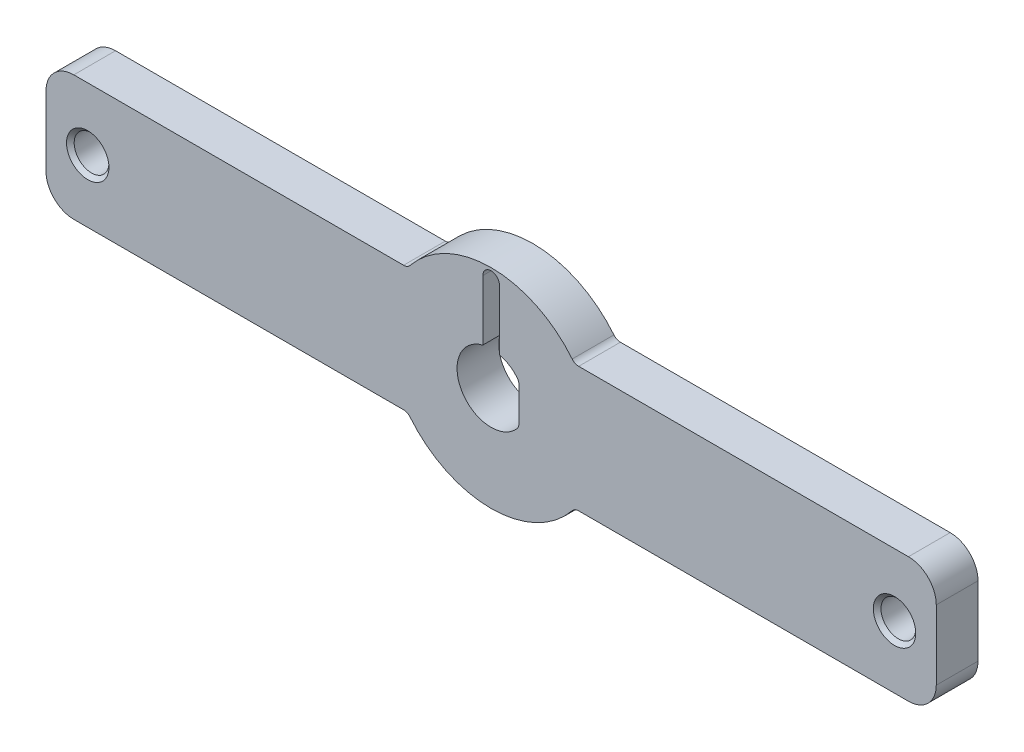
ISO-10303-21;
HEADER;
FILE_DESCRIPTION(('STEP AP214'),'2;1');
FILE_NAME('part.step','',(''),(''),'','','');
FILE_SCHEMA(('AUTOMOTIVE_DESIGN { 1 0 10303 214 1 1 1 1 }'));
ENDSEC;
DATA;
#1=APPLICATION_CONTEXT('core data for automotive mechanical design processes');
#2=APPLICATION_PROTOCOL_DEFINITION('international standard','automotive_design',2000,#1);
#3=PRODUCT_CONTEXT('',#1,'mechanical');
#4=PRODUCT('Part','Part','',(#3));
#5=PRODUCT_RELATED_PRODUCT_CATEGORY('part','',(#4));
#6=PRODUCT_DEFINITION_FORMATION('','',#4);
#7=PRODUCT_DEFINITION_CONTEXT('part definition',#1,'design');
#8=PRODUCT_DEFINITION('design','',#6,#7);
#9=PRODUCT_DEFINITION_SHAPE('','',#8);
#10=(LENGTH_UNIT() NAMED_UNIT(*) SI_UNIT(.MILLI.,.METRE.));
#11=(NAMED_UNIT(*) PLANE_ANGLE_UNIT() SI_UNIT($,.RADIAN.));
#12=(NAMED_UNIT(*) SI_UNIT($,.STERADIAN.) SOLID_ANGLE_UNIT());
#13=UNCERTAINTY_MEASURE_WITH_UNIT(LENGTH_MEASURE(1.E-05),#10,'distance_accuracy_value','');
#14=(GEOMETRIC_REPRESENTATION_CONTEXT(3) GLOBAL_UNCERTAINTY_ASSIGNED_CONTEXT((#13)) GLOBAL_UNIT_ASSIGNED_CONTEXT((#10,
#11,#12)) REPRESENTATION_CONTEXT('',''));
#15=CARTESIAN_POINT('',(0.,0.,0.));
#16=DIRECTION('',(0.,0.,1.));
#17=DIRECTION('',(1.,0.,0.));
#18=AXIS2_PLACEMENT_3D('',#15,#16,#17);
#19=CARTESIAN_POINT('',(0.,0.,3.));
#20=DIRECTION('',(0.,0.,1.));
#21=DIRECTION('',(1.,0.,0.));
#22=AXIS2_PLACEMENT_3D('',#19,#20,#21);
#23=PLANE('',#22);
#24=CARTESIAN_POINT('',(-29.,0.,3.));
#25=DIRECTION('',(0.,0.,1.));
#26=DIRECTION('',(1.,0.,0.));
#27=AXIS2_PLACEMENT_3D('',#24,#25,#26);
#28=CIRCLE('',#27,1.525);
#29=CARTESIAN_POINT('',(-27.475,0.,3.));
#30=VERTEX_POINT('',#29);
#31=EDGE_CURVE('E408',#30,#30,#28,.T.);
#32=ORIENTED_EDGE('',*,*,#31,.F.);
#33=EDGE_LOOP('',(#32));
#34=FACE_BOUND('',#33,.T.);
#35=CARTESIAN_POINT('',(29.,0.,3.));
#36=DIRECTION('',(0.,0.,1.));
#37=DIRECTION('',(1.,0.,0.));
#38=AXIS2_PLACEMENT_3D('',#35,#36,#37);
#39=CIRCLE('',#38,1.525);
#40=CARTESIAN_POINT('',(30.525,0.,3.));
#41=VERTEX_POINT('',#40);
#42=EDGE_CURVE('E628',#41,#41,#39,.T.);
#43=ORIENTED_EDGE('',*,*,#42,.F.);
#44=EDGE_LOOP('',(#43));
#45=FACE_BOUND('',#44,.T.);
#46=DIRECTION('',(-1.,0.,0.));
#47=VECTOR('',#46,1.);
#48=CARTESIAN_POINT('',(6.,4.5,3.));
#49=LINE('',#48,#47);
#50=CARTESIAN_POINT('',(30.,4.5,3.));
#51=VERTEX_POINT('',#50);
#52=CARTESIAN_POINT('',(6.29285308902091,4.5,3.));
#53=VERTEX_POINT('',#52);
#54=EDGE_CURVE('E286',#51,#53,#49,.T.);
#55=ORIENTED_EDGE('',*,*,#54,.T.);
#56=CARTESIAN_POINT('',(6.29285308902091,5.1,3.));
#57=DIRECTION('',(0.,0.,1.));
#58=DIRECTION('',(1.,0.,0.));
#59=AXIS2_PLACEMENT_3D('',#56,#57,#58);
#60=CIRCLE('',#59,0.6);
#61=CARTESIAN_POINT('',(5.82671582316751,4.72222222222222,3.));
#62=VERTEX_POINT('',#61);
#63=EDGE_CURVE('E382',#53,#62,#60,.F.);
#64=ORIENTED_EDGE('',*,*,#63,.T.);
#65=CARTESIAN_POINT('',(0.,0.,3.));
#66=DIRECTION('',(0.,0.,1.));
#67=DIRECTION('',(1.,0.,0.));
#68=AXIS2_PLACEMENT_3D('',#65,#66,#67);
#69=CIRCLE('',#68,7.5);
#70=CARTESIAN_POINT('',(-5.82671582316751,4.72222222222222,3.));
#71=VERTEX_POINT('',#70);
#72=EDGE_CURVE('E260',#62,#71,#69,.T.);
#73=ORIENTED_EDGE('',*,*,#72,.T.);
#74=CARTESIAN_POINT('',(-6.29285308902091,5.1,3.));
#75=DIRECTION('',(0.,0.,1.));
#76=DIRECTION('',(1.,0.,0.));
#77=AXIS2_PLACEMENT_3D('',#74,#75,#76);
#78=CIRCLE('',#77,0.6);
#79=CARTESIAN_POINT('',(-6.29285308902091,4.5,3.));
#80=VERTEX_POINT('',#79);
#81=EDGE_CURVE('E386',#71,#80,#78,.F.);
#82=ORIENTED_EDGE('',*,*,#81,.T.);
#83=DIRECTION('',(-1.,0.,0.));
#84=VECTOR('',#83,1.);
#85=CARTESIAN_POINT('',(-30.,4.5,3.));
#86=LINE('',#85,#84);
#87=CARTESIAN_POINT('',(-30.,4.5,3.));
#88=VERTEX_POINT('',#87);
#89=EDGE_CURVE('E263',#80,#88,#86,.T.);
#90=ORIENTED_EDGE('',*,*,#89,.T.);
#91=CARTESIAN_POINT('',(-30.,2.5,3.));
#92=DIRECTION('',(0.,0.,1.));
#93=DIRECTION('',(1.,0.,0.));
#94=AXIS2_PLACEMENT_3D('',#91,#92,#93);
#95=CIRCLE('',#94,2.);
#96=CARTESIAN_POINT('',(-32.,2.5,3.));
#97=VERTEX_POINT('',#96);
#98=EDGE_CURVE('E266',#88,#97,#95,.T.);
#99=ORIENTED_EDGE('',*,*,#98,.T.);
#100=DIRECTION('',(0.,-1.,0.));
#101=VECTOR('',#100,1.);
#102=CARTESIAN_POINT('',(-32.,2.5,3.));
#103=LINE('',#102,#101);
#104=CARTESIAN_POINT('',(-32.,-2.5,3.));
#105=VERTEX_POINT('',#104);
#106=EDGE_CURVE('E268',#97,#105,#103,.T.);
#107=ORIENTED_EDGE('',*,*,#106,.T.);
#108=CARTESIAN_POINT('',(-30.,-2.5,3.));
#109=DIRECTION('',(0.,0.,1.));
#110=DIRECTION('',(1.,0.,0.));
#111=AXIS2_PLACEMENT_3D('',#108,#109,#110);
#112=CIRCLE('',#111,2.);
#113=CARTESIAN_POINT('',(-30.,-4.5,3.));
#114=VERTEX_POINT('',#113);
#115=EDGE_CURVE('E270',#105,#114,#112,.T.);
#116=ORIENTED_EDGE('',*,*,#115,.T.);
#117=DIRECTION('',(1.,0.,0.));
#118=VECTOR('',#117,1.);
#119=CARTESIAN_POINT('',(-30.,-4.5,3.));
#120=LINE('',#119,#118);
#121=CARTESIAN_POINT('',(-6.29285308902091,-4.5,3.));
#122=VERTEX_POINT('',#121);
#123=EDGE_CURVE('E272',#114,#122,#120,.T.);
#124=ORIENTED_EDGE('',*,*,#123,.T.);
#125=CARTESIAN_POINT('',(-6.29285308902091,-5.1,3.));
#126=DIRECTION('',(0.,0.,1.));
#127=DIRECTION('',(1.,0.,0.));
#128=AXIS2_PLACEMENT_3D('',#125,#126,#127);
#129=CIRCLE('',#128,0.6);
#130=CARTESIAN_POINT('',(-5.82671582316751,-4.72222222222222,3.));
#131=VERTEX_POINT('',#130);
#132=EDGE_CURVE('E374',#122,#131,#129,.F.);
#133=ORIENTED_EDGE('',*,*,#132,.T.);
#134=CARTESIAN_POINT('',(0.,0.,3.));
#135=DIRECTION('',(0.,0.,1.));
#136=DIRECTION('',(1.,0.,0.));
#137=AXIS2_PLACEMENT_3D('',#134,#135,#136);
#138=CIRCLE('',#137,7.5);
#139=CARTESIAN_POINT('',(5.82671582316751,-4.72222222222222,3.));
#140=VERTEX_POINT('',#139);
#141=EDGE_CURVE('E275',#131,#140,#138,.T.);
#142=ORIENTED_EDGE('',*,*,#141,.T.);
#143=CARTESIAN_POINT('',(6.29285308902091,-5.1,3.));
#144=DIRECTION('',(0.,0.,1.));
#145=DIRECTION('',(1.,0.,0.));
#146=AXIS2_PLACEMENT_3D('',#143,#144,#145);
#147=CIRCLE('',#146,0.6);
#148=CARTESIAN_POINT('',(6.29285308902091,-4.5,3.));
#149=VERTEX_POINT('',#148);
#150=EDGE_CURVE('E378',#140,#149,#147,.F.);
#151=ORIENTED_EDGE('',*,*,#150,.T.);
#152=DIRECTION('',(1.,0.,0.));
#153=VECTOR('',#152,1.);
#154=CARTESIAN_POINT('',(6.,-4.5,3.));
#155=LINE('',#154,#153);
#156=CARTESIAN_POINT('',(30.,-4.5,3.));
#157=VERTEX_POINT('',#156);
#158=EDGE_CURVE('E278',#149,#157,#155,.T.);
#159=ORIENTED_EDGE('',*,*,#158,.T.);
#160=CARTESIAN_POINT('',(30.,-2.5,3.));
#161=DIRECTION('',(0.,0.,1.));
#162=DIRECTION('',(1.,0.,0.));
#163=AXIS2_PLACEMENT_3D('',#160,#161,#162);
#164=CIRCLE('',#163,2.);
#165=CARTESIAN_POINT('',(32.,-2.5,3.));
#166=VERTEX_POINT('',#165);
#167=EDGE_CURVE('E280',#157,#166,#164,.T.);
#168=ORIENTED_EDGE('',*,*,#167,.T.);
#169=DIRECTION('',(0.,1.,0.));
#170=VECTOR('',#169,1.);
#171=CARTESIAN_POINT('',(32.,2.5,3.));
#172=LINE('',#171,#170);
#173=CARTESIAN_POINT('',(32.,2.5,3.));
#174=VERTEX_POINT('',#173);
#175=EDGE_CURVE('E282',#166,#174,#172,.T.);
#176=ORIENTED_EDGE('',*,*,#175,.T.);
#177=CARTESIAN_POINT('',(30.,2.5,3.));
#178=DIRECTION('',(0.,0.,1.));
#179=DIRECTION('',(-1.,0.,0.));
#180=AXIS2_PLACEMENT_3D('',#177,#178,#179);
#181=CIRCLE('',#180,2.);
#182=EDGE_CURVE('E284',#174,#51,#181,.T.);
#183=ORIENTED_EDGE('',*,*,#182,.T.);
#184=EDGE_LOOP('',(#55,#64,#73,#82,#90,#99,#107,#116,#124,#133,#142,#151,#159,#168,#176,#183));
#185=FACE_BOUND('',#184,.T.);
#186=DIRECTION('',(0.,1.,0.));
#187=VECTOR('',#186,1.);
#188=CARTESIAN_POINT('',(0.599999999999999,7.27530068107154,3.));
#189=LINE('',#188,#187);
#190=CARTESIAN_POINT('',(0.6,2.37539470404394,3.));
#191=VERTEX_POINT('',#190);
#192=CARTESIAN_POINT('',(0.599999999999999,6.7,3.));
#193=VERTEX_POINT('',#192);
#194=EDGE_CURVE('E221',#191,#193,#189,.T.);
#195=ORIENTED_EDGE('',*,*,#194,.F.);
#196=CARTESIAN_POINT('',(0.,0.,3.));
#197=DIRECTION('',(0.,0.,1.));
#198=DIRECTION('',(1.,0.,0.));
#199=AXIS2_PLACEMENT_3D('',#196,#197,#198);
#200=CIRCLE('',#199,2.45);
#201=CARTESIAN_POINT('',(1.85405405405405,1.6015566067566,3.));
#202=VERTEX_POINT('',#201);
#203=EDGE_CURVE('E212',#202,#191,#200,.T.);
#204=ORIENTED_EDGE('',*,*,#203,.F.);
#205=CARTESIAN_POINT('',(1.4,1.20933866224478,3.));
#206=DIRECTION('',(0.,0.,1.));
#207=DIRECTION('',(1.,0.,0.));
#208=AXIS2_PLACEMENT_3D('',#205,#206,#207);
#209=CIRCLE('',#208,0.6);
#210=CARTESIAN_POINT('',(2.,1.20933866224478,3.));
#211=VERTEX_POINT('',#210);
#212=EDGE_CURVE('E394',#202,#211,#209,.F.);
#213=ORIENTED_EDGE('',*,*,#212,.T.);
#214=DIRECTION('',(0.,1.,0.));
#215=VECTOR('',#214,1.);
#216=CARTESIAN_POINT('',(2.,1.41509716980849,3.));
#217=LINE('',#216,#215);
#218=CARTESIAN_POINT('',(2.,-1.20933866224478,3.));
#219=VERTEX_POINT('',#218);
#220=EDGE_CURVE('E244',#219,#211,#217,.T.);
#221=ORIENTED_EDGE('',*,*,#220,.F.);
#222=CARTESIAN_POINT('',(1.4,-1.20933866224478,3.));
#223=DIRECTION('',(0.,0.,1.));
#224=DIRECTION('',(1.,0.,0.));
#225=AXIS2_PLACEMENT_3D('',#222,#223,#224);
#226=CIRCLE('',#225,0.6);
#227=CARTESIAN_POINT('',(1.85405405405405,-1.6015566067566,3.));
#228=VERTEX_POINT('',#227);
#229=EDGE_CURVE('E390',#219,#228,#226,.F.);
#230=ORIENTED_EDGE('',*,*,#229,.T.);
#231=CARTESIAN_POINT('',(0.,0.,3.));
#232=DIRECTION('',(0.,0.,1.));
#233=DIRECTION('',(1.,0.,0.));
#234=AXIS2_PLACEMENT_3D('',#231,#232,#233);
#235=CIRCLE('',#234,2.45);
#236=CARTESIAN_POINT('',(-0.6,2.37539470404394,3.));
#237=VERTEX_POINT('',#236);
#238=EDGE_CURVE('E238',#237,#228,#235,.T.);
#239=ORIENTED_EDGE('',*,*,#238,.F.);
#240=DIRECTION('',(0.,-1.,0.));
#241=VECTOR('',#240,1.);
#242=CARTESIAN_POINT('',(-0.600000000000001,7.27530068107154,3.));
#243=LINE('',#242,#241);
#244=CARTESIAN_POINT('',(-0.600000000000001,6.7,3.));
#245=VERTEX_POINT('',#244);
#246=EDGE_CURVE('E236',#245,#237,#243,.T.);
#247=ORIENTED_EDGE('',*,*,#246,.F.);
#248=CARTESIAN_POINT('',(0.,6.7,3.));
#249=DIRECTION('',(0.,0.,1.));
#250=DIRECTION('',(1.,0.,0.));
#251=AXIS2_PLACEMENT_3D('',#248,#249,#250);
#252=CIRCLE('',#251,0.6);
#253=CARTESIAN_POINT('',(0.,7.3,3.));
#254=VERTEX_POINT('',#253);
#255=EDGE_CURVE('E11',#245,#254,#252,.F.);
#256=ORIENTED_EDGE('',*,*,#255,.T.);
#257=CARTESIAN_POINT('',(0.,6.7,3.));
#258=DIRECTION('',(0.,0.,1.));
#259=DIRECTION('',(1.,0.,0.));
#260=AXIS2_PLACEMENT_3D('',#257,#258,#259);
#261=CIRCLE('',#260,0.6);
#262=EDGE_CURVE('E235',#254,#193,#261,.F.);
#263=ORIENTED_EDGE('',*,*,#262,.T.);
#264=EDGE_LOOP('',(#195,#204,#213,#221,#230,#239,#247,#256,#263));
#265=FACE_BOUND('',#264,.T.);
#266=ADVANCED_FACE('F45',(#34,#45,#185,#265),#23,.T.);
#267=CARTESIAN_POINT('',(0.,0.,0.));
#268=DIRECTION('',(0.,0.,1.));
#269=DIRECTION('',(1.,0.,0.));
#270=AXIS2_PLACEMENT_3D('',#267,#268,#269);
#271=PLANE('',#270);
#272=CARTESIAN_POINT('',(-29.,0.,0.));
#273=DIRECTION('',(0.,0.,1.));
#274=DIRECTION('',(1.,0.,0.));
#275=AXIS2_PLACEMENT_3D('',#272,#273,#274);
#276=CIRCLE('',#275,1.25);
#277=CARTESIAN_POINT('',(-27.75,0.,0.));
#278=VERTEX_POINT('',#277);
#279=EDGE_CURVE('E623',#278,#278,#276,.T.);
#280=ORIENTED_EDGE('',*,*,#279,.T.);
#281=EDGE_LOOP('',(#280));
#282=FACE_BOUND('',#281,.T.);
#283=CARTESIAN_POINT('',(29.,0.,0.));
#284=DIRECTION('',(0.,0.,1.));
#285=DIRECTION('',(1.,0.,0.));
#286=AXIS2_PLACEMENT_3D('',#283,#284,#285);
#287=CIRCLE('',#286,1.25);
#288=CARTESIAN_POINT('',(30.25,0.,0.));
#289=VERTEX_POINT('',#288);
#290=EDGE_CURVE('E249',#289,#289,#287,.T.);
#291=ORIENTED_EDGE('',*,*,#290,.T.);
#292=EDGE_LOOP('',(#291));
#293=FACE_BOUND('',#292,.T.);
#294=DIRECTION('',(-1.,0.,0.));
#295=VECTOR('',#294,1.);
#296=CARTESIAN_POINT('',(-30.,4.5,0.));
#297=LINE('',#296,#295);
#298=CARTESIAN_POINT('',(-6.29285308902091,4.5,0.));
#299=VERTEX_POINT('',#298);
#300=CARTESIAN_POINT('',(-30.,4.5,0.));
#301=VERTEX_POINT('',#300);
#302=EDGE_CURVE('E231',#299,#301,#297,.T.);
#303=ORIENTED_EDGE('',*,*,#302,.F.);
#304=CARTESIAN_POINT('',(-6.29285308902091,5.1,0.));
#305=DIRECTION('',(0.,0.,1.));
#306=DIRECTION('',(1.,0.,0.));
#307=AXIS2_PLACEMENT_3D('',#304,#305,#306);
#308=CIRCLE('',#307,0.6);
#309=CARTESIAN_POINT('',(-5.82671582316751,4.72222222222222,0.));
#310=VERTEX_POINT('',#309);
#311=EDGE_CURVE('E384',#299,#310,#308,.T.);
#312=ORIENTED_EDGE('',*,*,#311,.T.);
#313=CARTESIAN_POINT('',(0.,0.,0.));
#314=DIRECTION('',(0.,0.,1.));
#315=DIRECTION('',(1.,0.,0.));
#316=AXIS2_PLACEMENT_3D('',#313,#314,#315);
#317=CIRCLE('',#316,7.5);
#318=CARTESIAN_POINT('',(5.82671582316751,4.72222222222222,0.));
#319=VERTEX_POINT('',#318);
#320=EDGE_CURVE('E264',#319,#310,#317,.T.);
#321=ORIENTED_EDGE('',*,*,#320,.F.);
#322=CARTESIAN_POINT('',(6.29285308902091,5.1,0.));
#323=DIRECTION('',(0.,0.,1.));
#324=DIRECTION('',(1.,0.,0.));
#325=AXIS2_PLACEMENT_3D('',#322,#323,#324);
#326=CIRCLE('',#325,0.6);
#327=CARTESIAN_POINT('',(6.29285308902091,4.5,0.));
#328=VERTEX_POINT('',#327);
#329=EDGE_CURVE('E380',#319,#328,#326,.T.);
#330=ORIENTED_EDGE('',*,*,#329,.T.);
#331=DIRECTION('',(-1.,0.,0.));
#332=VECTOR('',#331,1.);
#333=CARTESIAN_POINT('',(6.,4.5,0.));
#334=LINE('',#333,#332);
#335=CARTESIAN_POINT('',(30.,4.5,0.));
#336=VERTEX_POINT('',#335);
#337=EDGE_CURVE('E311',#336,#328,#334,.T.);
#338=ORIENTED_EDGE('',*,*,#337,.F.);
#339=CARTESIAN_POINT('',(30.,2.5,0.));
#340=DIRECTION('',(0.,0.,1.));
#341=DIRECTION('',(-1.,0.,0.));
#342=AXIS2_PLACEMENT_3D('',#339,#340,#341);
#343=CIRCLE('',#342,2.);
#344=CARTESIAN_POINT('',(32.,2.5,0.));
#345=VERTEX_POINT('',#344);
#346=EDGE_CURVE('E309',#345,#336,#343,.T.);
#347=ORIENTED_EDGE('',*,*,#346,.F.);
#348=DIRECTION('',(0.,1.,0.));
#349=VECTOR('',#348,1.);
#350=CARTESIAN_POINT('',(32.,2.5,0.));
#351=LINE('',#350,#349);
#352=CARTESIAN_POINT('',(32.,-2.5,0.));
#353=VERTEX_POINT('',#352);
#354=EDGE_CURVE('E307',#353,#345,#351,.T.);
#355=ORIENTED_EDGE('',*,*,#354,.F.);
#356=CARTESIAN_POINT('',(30.,-2.5,0.));
#357=DIRECTION('',(0.,0.,1.));
#358=DIRECTION('',(1.,0.,0.));
#359=AXIS2_PLACEMENT_3D('',#356,#357,#358);
#360=CIRCLE('',#359,2.);
#361=CARTESIAN_POINT('',(30.,-4.5,0.));
#362=VERTEX_POINT('',#361);
#363=EDGE_CURVE('E305',#362,#353,#360,.T.);
#364=ORIENTED_EDGE('',*,*,#363,.F.);
#365=DIRECTION('',(1.,0.,0.));
#366=VECTOR('',#365,1.);
#367=CARTESIAN_POINT('',(6.,-4.5,0.));
#368=LINE('',#367,#366);
#369=CARTESIAN_POINT('',(6.29285308902091,-4.5,0.));
#370=VERTEX_POINT('',#369);
#371=EDGE_CURVE('E303',#370,#362,#368,.T.);
#372=ORIENTED_EDGE('',*,*,#371,.F.);
#373=CARTESIAN_POINT('',(6.29285308902091,-5.1,0.));
#374=DIRECTION('',(0.,0.,1.));
#375=DIRECTION('',(1.,0.,0.));
#376=AXIS2_PLACEMENT_3D('',#373,#374,#375);
#377=CIRCLE('',#376,0.6);
#378=CARTESIAN_POINT('',(5.82671582316751,-4.72222222222222,0.));
#379=VERTEX_POINT('',#378);
#380=EDGE_CURVE('E376',#370,#379,#377,.T.);
#381=ORIENTED_EDGE('',*,*,#380,.T.);
#382=CARTESIAN_POINT('',(0.,0.,0.));
#383=DIRECTION('',(0.,0.,1.));
#384=DIRECTION('',(1.,0.,0.));
#385=AXIS2_PLACEMENT_3D('',#382,#383,#384);
#386=CIRCLE('',#385,7.5);
#387=CARTESIAN_POINT('',(-5.82671582316751,-4.72222222222222,0.));
#388=VERTEX_POINT('',#387);
#389=EDGE_CURVE('E300',#388,#379,#386,.T.);
#390=ORIENTED_EDGE('',*,*,#389,.F.);
#391=CARTESIAN_POINT('',(-6.29285308902091,-5.1,0.));
#392=DIRECTION('',(0.,0.,1.));
#393=DIRECTION('',(1.,0.,0.));
#394=AXIS2_PLACEMENT_3D('',#391,#392,#393);
#395=CIRCLE('',#394,0.6);
#396=CARTESIAN_POINT('',(-6.29285308902091,-4.5,0.));
#397=VERTEX_POINT('',#396);
#398=EDGE_CURVE('E372',#388,#397,#395,.T.);
#399=ORIENTED_EDGE('',*,*,#398,.T.);
#400=DIRECTION('',(1.,0.,0.));
#401=VECTOR('',#400,1.);
#402=CARTESIAN_POINT('',(-30.,-4.5,0.));
#403=LINE('',#402,#401);
#404=CARTESIAN_POINT('',(-30.,-4.5,0.));
#405=VERTEX_POINT('',#404);
#406=EDGE_CURVE('E297',#405,#397,#403,.T.);
#407=ORIENTED_EDGE('',*,*,#406,.F.);
#408=CARTESIAN_POINT('',(-30.,-2.5,0.));
#409=DIRECTION('',(0.,0.,1.));
#410=DIRECTION('',(1.,0.,0.));
#411=AXIS2_PLACEMENT_3D('',#408,#409,#410);
#412=CIRCLE('',#411,2.);
#413=CARTESIAN_POINT('',(-32.,-2.5,0.));
#414=VERTEX_POINT('',#413);
#415=EDGE_CURVE('E295',#414,#405,#412,.T.);
#416=ORIENTED_EDGE('',*,*,#415,.F.);
#417=DIRECTION('',(0.,-1.,0.));
#418=VECTOR('',#417,1.);
#419=CARTESIAN_POINT('',(-32.,2.5,0.));
#420=LINE('',#419,#418);
#421=CARTESIAN_POINT('',(-32.,2.5,0.));
#422=VERTEX_POINT('',#421);
#423=EDGE_CURVE('E293',#422,#414,#420,.T.);
#424=ORIENTED_EDGE('',*,*,#423,.F.);
#425=CARTESIAN_POINT('',(-30.,2.5,0.));
#426=DIRECTION('',(0.,0.,1.));
#427=DIRECTION('',(1.,0.,0.));
#428=AXIS2_PLACEMENT_3D('',#425,#426,#427);
#429=CIRCLE('',#428,2.);
#430=EDGE_CURVE('E291',#301,#422,#429,.T.);
#431=ORIENTED_EDGE('',*,*,#430,.F.);
#432=EDGE_LOOP('',(#303,#312,#321,#330,#338,#347,#355,#364,#372,#381,#390,#399,#407,#416,#424,#431));
#433=FACE_BOUND('',#432,.T.);
#434=DIRECTION('',(0.,1.,0.));
#435=VECTOR('',#434,1.);
#436=CARTESIAN_POINT('',(2.,1.41509716980849,0.));
#437=LINE('',#436,#435);
#438=CARTESIAN_POINT('',(2.,-1.20933866224478,0.));
#439=VERTEX_POINT('',#438);
#440=CARTESIAN_POINT('',(2.,1.20933866224478,0.));
#441=VERTEX_POINT('',#440);
#442=EDGE_CURVE('E222',#439,#441,#437,.T.);
#443=ORIENTED_EDGE('',*,*,#442,.T.);
#444=CARTESIAN_POINT('',(1.4,1.20933866224478,0.));
#445=DIRECTION('',(0.,0.,1.));
#446=DIRECTION('',(1.,0.,0.));
#447=AXIS2_PLACEMENT_3D('',#444,#445,#446);
#448=CIRCLE('',#447,0.6);
#449=CARTESIAN_POINT('',(1.85405405405405,1.6015566067566,0.));
#450=VERTEX_POINT('',#449);
#451=EDGE_CURVE('E392',#441,#450,#448,.T.);
#452=ORIENTED_EDGE('',*,*,#451,.T.);
#453=CARTESIAN_POINT('',(0.,0.,0.));
#454=DIRECTION('',(0.,0.,1.));
#455=DIRECTION('',(1.,0.,0.));
#456=AXIS2_PLACEMENT_3D('',#453,#454,#455);
#457=CIRCLE('',#456,2.45);
#458=CARTESIAN_POINT('',(0.6,2.37539470404394,0.));
#459=VERTEX_POINT('',#458);
#460=EDGE_CURVE('E247',#450,#459,#457,.T.);
#461=ORIENTED_EDGE('',*,*,#460,.T.);
#462=DIRECTION('',(0.,1.,0.));
#463=VECTOR('',#462,1.);
#464=CARTESIAN_POINT('',(0.599999999999999,7.27530068107154,0.));
#465=LINE('',#464,#463);
#466=CARTESIAN_POINT('',(0.599999999999999,6.7,0.));
#467=VERTEX_POINT('',#466);
#468=EDGE_CURVE('E230',#459,#467,#465,.T.);
#469=ORIENTED_EDGE('',*,*,#468,.T.);
#470=CARTESIAN_POINT('',(0.,6.7,0.));
#471=DIRECTION('',(0.,0.,1.));
#472=DIRECTION('',(1.,0.,0.));
#473=AXIS2_PLACEMENT_3D('',#470,#471,#472);
#474=CIRCLE('',#473,0.6);
#475=CARTESIAN_POINT('',(0.,7.3,0.));
#476=VERTEX_POINT('',#475);
#477=EDGE_CURVE('E67',#467,#476,#474,.T.);
#478=ORIENTED_EDGE('',*,*,#477,.T.);
#479=CARTESIAN_POINT('',(0.,6.7,0.));
#480=DIRECTION('',(0.,0.,1.));
#481=DIRECTION('',(1.,0.,0.));
#482=AXIS2_PLACEMENT_3D('',#479,#480,#481);
#483=CIRCLE('',#482,0.6);
#484=CARTESIAN_POINT('',(-0.600000000000001,6.7,0.));
#485=VERTEX_POINT('',#484);
#486=EDGE_CURVE('E54',#476,#485,#483,.T.);
#487=ORIENTED_EDGE('',*,*,#486,.T.);
#488=DIRECTION('',(0.,-1.,0.));
#489=VECTOR('',#488,1.);
#490=CARTESIAN_POINT('',(-0.600000000000001,7.27530068107154,0.));
#491=LINE('',#490,#489);
#492=CARTESIAN_POINT('',(-0.6,2.37539470404394,0.));
#493=VERTEX_POINT('',#492);
#494=EDGE_CURVE('E251',#485,#493,#491,.T.);
#495=ORIENTED_EDGE('',*,*,#494,.T.);
#496=CARTESIAN_POINT('',(0.,0.,0.));
#497=DIRECTION('',(0.,0.,1.));
#498=DIRECTION('',(1.,0.,0.));
#499=AXIS2_PLACEMENT_3D('',#496,#497,#498);
#500=CIRCLE('',#499,2.45);
#501=CARTESIAN_POINT('',(1.85405405405405,-1.6015566067566,0.));
#502=VERTEX_POINT('',#501);
#503=EDGE_CURVE('E253',#493,#502,#500,.T.);
#504=ORIENTED_EDGE('',*,*,#503,.T.);
#505=CARTESIAN_POINT('',(1.4,-1.20933866224478,0.));
#506=DIRECTION('',(0.,0.,1.));
#507=DIRECTION('',(1.,0.,0.));
#508=AXIS2_PLACEMENT_3D('',#505,#506,#507);
#509=CIRCLE('',#508,0.6);
#510=EDGE_CURVE('E388',#502,#439,#509,.T.);
#511=ORIENTED_EDGE('',*,*,#510,.T.);
#512=EDGE_LOOP('',(#443,#452,#461,#469,#478,#487,#495,#504,#511));
#513=FACE_BOUND('',#512,.T.);
#514=ADVANCED_FACE('F399',(#282,#293,#433,#513),#271,.F.);
#515=CARTESIAN_POINT('',(-30.,4.5,3.));
#516=DIRECTION('',(0.,-1.,0.));
#517=DIRECTION('',(0.,0.,-1.));
#518=AXIS2_PLACEMENT_3D('',#515,#516,#517);
#519=PLANE('',#518);
#520=ORIENTED_EDGE('',*,*,#89,.F.);
#521=DIRECTION('',(0.,0.,1.));
#522=VECTOR('',#521,1.);
#523=CARTESIAN_POINT('',(-6.29285308902091,4.5,0.));
#524=LINE('',#523,#522);
#525=EDGE_CURVE('E356',#80,#299,#524,.F.);
#526=ORIENTED_EDGE('',*,*,#525,.T.);
#527=ORIENTED_EDGE('',*,*,#302,.T.);
#528=DIRECTION('',(0.,0.,-1.));
#529=VECTOR('',#528,1.);
#530=CARTESIAN_POINT('',(-30.,4.5,3.));
#531=LINE('',#530,#529);
#532=EDGE_CURVE('E336',#88,#301,#531,.T.);
#533=ORIENTED_EDGE('',*,*,#532,.F.);
#534=EDGE_LOOP('',(#520,#526,#527,#533));
#535=FACE_BOUND('',#534,.T.);
#536=ADVANCED_FACE('F441',(#535),#519,.F.);
#537=CARTESIAN_POINT('',(-30.,2.5,3.));
#538=DIRECTION('',(0.,0.,-1.));
#539=DIRECTION('',(-1.,0.,0.));
#540=AXIS2_PLACEMENT_3D('',#537,#538,#539);
#541=CYLINDRICAL_SURFACE('',#540,2.);
#542=ORIENTED_EDGE('',*,*,#430,.T.);
#543=DIRECTION('',(0.,0.,-1.));
#544=VECTOR('',#543,1.);
#545=CARTESIAN_POINT('',(-32.,2.5,3.));
#546=LINE('',#545,#544);
#547=EDGE_CURVE('E333',#97,#422,#546,.T.);
#548=ORIENTED_EDGE('',*,*,#547,.F.);
#549=ORIENTED_EDGE('',*,*,#98,.F.);
#550=ORIENTED_EDGE('',*,*,#532,.T.);
#551=EDGE_LOOP('',(#542,#548,#549,#550));
#552=FACE_BOUND('',#551,.T.);
#553=ADVANCED_FACE('F488',(#552),#541,.T.);
#554=CARTESIAN_POINT('',(-32.,2.5,3.));
#555=DIRECTION('',(1.,0.,0.));
#556=DIRECTION('',(0.,1.,0.));
#557=AXIS2_PLACEMENT_3D('',#554,#555,#556);
#558=PLANE('',#557);
#559=ORIENTED_EDGE('',*,*,#423,.T.);
#560=DIRECTION('',(0.,0.,-1.));
#561=VECTOR('',#560,1.);
#562=CARTESIAN_POINT('',(-32.,-2.5,3.));
#563=LINE('',#562,#561);
#564=EDGE_CURVE('E330',#105,#414,#563,.T.);
#565=ORIENTED_EDGE('',*,*,#564,.F.);
#566=ORIENTED_EDGE('',*,*,#106,.F.);
#567=ORIENTED_EDGE('',*,*,#547,.T.);
#568=EDGE_LOOP('',(#559,#565,#566,#567));
#569=FACE_BOUND('',#568,.T.);
#570=ADVANCED_FACE('F484',(#569),#558,.F.);
#571=CARTESIAN_POINT('',(-30.,-2.5,3.));
#572=DIRECTION('',(0.,0.,-1.));
#573=DIRECTION('',(-1.,0.,0.));
#574=AXIS2_PLACEMENT_3D('',#571,#572,#573);
#575=CYLINDRICAL_SURFACE('',#574,2.);
#576=ORIENTED_EDGE('',*,*,#415,.T.);
#577=DIRECTION('',(0.,0.,-1.));
#578=VECTOR('',#577,1.);
#579=CARTESIAN_POINT('',(-30.,-4.5,3.));
#580=LINE('',#579,#578);
#581=EDGE_CURVE('E327',#114,#405,#580,.T.);
#582=ORIENTED_EDGE('',*,*,#581,.F.);
#583=ORIENTED_EDGE('',*,*,#115,.F.);
#584=ORIENTED_EDGE('',*,*,#564,.T.);
#585=EDGE_LOOP('',(#576,#582,#583,#584));
#586=FACE_BOUND('',#585,.T.);
#587=ADVANCED_FACE('F480',(#586),#575,.T.);
#588=CARTESIAN_POINT('',(-30.,-4.5,3.));
#589=DIRECTION('',(0.,1.,0.));
#590=DIRECTION('',(0.,0.,1.));
#591=AXIS2_PLACEMENT_3D('',#588,#589,#590);
#592=PLANE('',#591);
#593=ORIENTED_EDGE('',*,*,#406,.T.);
#594=DIRECTION('',(0.,0.,1.));
#595=VECTOR('',#594,1.);
#596=CARTESIAN_POINT('',(-6.29285308902091,-4.5,3.));
#597=LINE('',#596,#595);
#598=EDGE_CURVE('E344',#397,#122,#597,.T.);
#599=ORIENTED_EDGE('',*,*,#598,.T.);
#600=ORIENTED_EDGE('',*,*,#123,.F.);
#601=ORIENTED_EDGE('',*,*,#581,.T.);
#602=EDGE_LOOP('',(#593,#599,#600,#601));
#603=FACE_BOUND('',#602,.T.);
#604=ADVANCED_FACE('F476',(#603),#592,.F.);
#605=CARTESIAN_POINT('',(0.,0.,3.));
#606=DIRECTION('',(0.,0.,-1.));
#607=DIRECTION('',(-1.,0.,0.));
#608=AXIS2_PLACEMENT_3D('',#605,#606,#607);
#609=CYLINDRICAL_SURFACE('',#608,7.5);
#610=ORIENTED_EDGE('',*,*,#141,.F.);
#611=DIRECTION('',(0.,0.,-1.));
#612=VECTOR('',#611,1.);
#613=CARTESIAN_POINT('',(-5.82671582316751,-4.72222222222222,3.));
#614=LINE('',#613,#612);
#615=EDGE_CURVE('E341',#131,#388,#614,.T.);
#616=ORIENTED_EDGE('',*,*,#615,.T.);
#617=ORIENTED_EDGE('',*,*,#389,.T.);
#618=DIRECTION('',(0.,0.,-1.));
#619=VECTOR('',#618,1.);
#620=CARTESIAN_POINT('',(5.82671582316751,-4.72222222222222,3.));
#621=LINE('',#620,#619);
#622=EDGE_CURVE('E339',#379,#140,#621,.F.);
#623=ORIENTED_EDGE('',*,*,#622,.T.);
#624=EDGE_LOOP('',(#610,#616,#617,#623));
#625=FACE_BOUND('',#624,.T.);
#626=ADVANCED_FACE('F472',(#625),#609,.T.);
#627=CARTESIAN_POINT('',(6.,-4.5,3.));
#628=DIRECTION('',(0.,1.,0.));
#629=DIRECTION('',(-1.,0.,0.));
#630=AXIS2_PLACEMENT_3D('',#627,#628,#629);
#631=PLANE('',#630);
#632=ORIENTED_EDGE('',*,*,#158,.F.);
#633=DIRECTION('',(0.,0.,1.));
#634=VECTOR('',#633,1.);
#635=CARTESIAN_POINT('',(6.29285308902091,-4.5,0.));
#636=LINE('',#635,#634);
#637=EDGE_CURVE('E346',#149,#370,#636,.F.);
#638=ORIENTED_EDGE('',*,*,#637,.T.);
#639=ORIENTED_EDGE('',*,*,#371,.T.);
#640=DIRECTION('',(0.,0.,-1.));
#641=VECTOR('',#640,1.);
#642=CARTESIAN_POINT('',(30.,-4.5,3.));
#643=LINE('',#642,#641);
#644=EDGE_CURVE('E324',#157,#362,#643,.T.);
#645=ORIENTED_EDGE('',*,*,#644,.F.);
#646=EDGE_LOOP('',(#632,#638,#639,#645));
#647=FACE_BOUND('',#646,.T.);
#648=ADVANCED_FACE('F468',(#647),#631,.F.);
#649=CARTESIAN_POINT('',(30.,-2.5,3.));
#650=DIRECTION('',(0.,0.,-1.));
#651=DIRECTION('',(-1.,0.,0.));
#652=AXIS2_PLACEMENT_3D('',#649,#650,#651);
#653=CYLINDRICAL_SURFACE('',#652,2.);
#654=ORIENTED_EDGE('',*,*,#363,.T.);
#655=DIRECTION('',(0.,0.,-1.));
#656=VECTOR('',#655,1.);
#657=CARTESIAN_POINT('',(32.,-2.5,3.));
#658=LINE('',#657,#656);
#659=EDGE_CURVE('E321',#166,#353,#658,.T.);
#660=ORIENTED_EDGE('',*,*,#659,.F.);
#661=ORIENTED_EDGE('',*,*,#167,.F.);
#662=ORIENTED_EDGE('',*,*,#644,.T.);
#663=EDGE_LOOP('',(#654,#660,#661,#662));
#664=FACE_BOUND('',#663,.T.);
#665=ADVANCED_FACE('F464',(#664),#653,.T.);
#666=CARTESIAN_POINT('',(32.,2.5,3.));
#667=DIRECTION('',(-1.,0.,0.));
#668=DIRECTION('',(0.,0.,1.));
#669=AXIS2_PLACEMENT_3D('',#666,#667,#668);
#670=PLANE('',#669);
#671=ORIENTED_EDGE('',*,*,#354,.T.);
#672=DIRECTION('',(0.,0.,-1.));
#673=VECTOR('',#672,1.);
#674=CARTESIAN_POINT('',(32.,2.5,3.));
#675=LINE('',#674,#673);
#676=EDGE_CURVE('E318',#174,#345,#675,.T.);
#677=ORIENTED_EDGE('',*,*,#676,.F.);
#678=ORIENTED_EDGE('',*,*,#175,.F.);
#679=ORIENTED_EDGE('',*,*,#659,.T.);
#680=EDGE_LOOP('',(#671,#677,#678,#679));
#681=FACE_BOUND('',#680,.T.);
#682=ADVANCED_FACE('F460',(#681),#670,.F.);
#683=CARTESIAN_POINT('',(30.,2.5,3.));
#684=DIRECTION('',(0.,0.,-1.));
#685=DIRECTION('',(-1.,0.,0.));
#686=AXIS2_PLACEMENT_3D('',#683,#684,#685);
#687=CYLINDRICAL_SURFACE('',#686,2.);
#688=ORIENTED_EDGE('',*,*,#346,.T.);
#689=DIRECTION('',(0.,0.,-1.));
#690=VECTOR('',#689,1.);
#691=CARTESIAN_POINT('',(30.,4.5,3.));
#692=LINE('',#691,#690);
#693=EDGE_CURVE('E289',#51,#336,#692,.T.);
#694=ORIENTED_EDGE('',*,*,#693,.F.);
#695=ORIENTED_EDGE('',*,*,#182,.F.);
#696=ORIENTED_EDGE('',*,*,#676,.T.);
#697=EDGE_LOOP('',(#688,#694,#695,#696));
#698=FACE_BOUND('',#697,.T.);
#699=ADVANCED_FACE('F456',(#698),#687,.T.);
#700=CARTESIAN_POINT('',(6.,4.5,3.));
#701=DIRECTION('',(0.,-1.,0.));
#702=DIRECTION('',(1.,0.,0.));
#703=AXIS2_PLACEMENT_3D('',#700,#701,#702);
#704=PLANE('',#703);
#705=ORIENTED_EDGE('',*,*,#337,.T.);
#706=DIRECTION('',(0.,0.,1.));
#707=VECTOR('',#706,1.);
#708=CARTESIAN_POINT('',(6.29285308902091,4.5,3.));
#709=LINE('',#708,#707);
#710=EDGE_CURVE('E354',#328,#53,#709,.T.);
#711=ORIENTED_EDGE('',*,*,#710,.T.);
#712=ORIENTED_EDGE('',*,*,#54,.F.);
#713=ORIENTED_EDGE('',*,*,#693,.T.);
#714=EDGE_LOOP('',(#705,#711,#712,#713));
#715=FACE_BOUND('',#714,.T.);
#716=ADVANCED_FACE('F452',(#715),#704,.F.);
#717=CARTESIAN_POINT('',(0.,0.,3.));
#718=DIRECTION('',(0.,0.,-1.));
#719=DIRECTION('',(-1.,0.,0.));
#720=AXIS2_PLACEMENT_3D('',#717,#718,#719);
#721=CYLINDRICAL_SURFACE('',#720,7.5);
#722=ORIENTED_EDGE('',*,*,#72,.F.);
#723=DIRECTION('',(0.,0.,-1.));
#724=VECTOR('',#723,1.);
#725=CARTESIAN_POINT('',(5.82671582316751,4.72222222222222,3.));
#726=LINE('',#725,#724);
#727=EDGE_CURVE('E351',#62,#319,#726,.T.);
#728=ORIENTED_EDGE('',*,*,#727,.T.);
#729=ORIENTED_EDGE('',*,*,#320,.T.);
#730=DIRECTION('',(0.,0.,-1.));
#731=VECTOR('',#730,1.);
#732=CARTESIAN_POINT('',(-5.82671582316751,4.72222222222222,3.));
#733=LINE('',#732,#731);
#734=EDGE_CURVE('E349',#310,#71,#733,.F.);
#735=ORIENTED_EDGE('',*,*,#734,.T.);
#736=EDGE_LOOP('',(#722,#728,#729,#735));
#737=FACE_BOUND('',#736,.T.);
#738=ADVANCED_FACE('F449',(#737),#721,.T.);
#739=CARTESIAN_POINT('',(0.,0.,3.));
#740=DIRECTION('',(0.,0.,-1.));
#741=DIRECTION('',(-1.,0.,0.));
#742=AXIS2_PLACEMENT_3D('',#739,#740,#741);
#743=CYLINDRICAL_SURFACE('',#742,2.45);
#744=ORIENTED_EDGE('',*,*,#460,.F.);
#745=DIRECTION('',(0.,0.,-1.));
#746=VECTOR('',#745,1.);
#747=CARTESIAN_POINT('',(1.85405405405405,1.6015566067566,3.));
#748=LINE('',#747,#746);
#749=EDGE_CURVE('E218',#450,#202,#748,.F.);
#750=ORIENTED_EDGE('',*,*,#749,.T.);
#751=ORIENTED_EDGE('',*,*,#203,.T.);
#752=DIRECTION('',(0.,0.,-1.));
#753=VECTOR('',#752,1.);
#754=CARTESIAN_POINT('',(0.6,2.37539470404394,3.));
#755=LINE('',#754,#753);
#756=EDGE_CURVE('E216',#191,#459,#755,.T.);
#757=ORIENTED_EDGE('',*,*,#756,.T.);
#758=EDGE_LOOP('',(#744,#750,#751,#757));
#759=FACE_BOUND('',#758,.T.);
#760=ADVANCED_FACE('F215',(#759),#743,.F.);
#761=CARTESIAN_POINT('',(0.599999999999999,7.27530068107154,3.));
#762=DIRECTION('',(-1.,0.,0.));
#763=DIRECTION('',(0.,-1.,0.));
#764=AXIS2_PLACEMENT_3D('',#761,#762,#763);
#765=PLANE('',#764);
#766=ORIENTED_EDGE('',*,*,#194,.T.);
#767=DIRECTION('',(0.,0.,1.));
#768=VECTOR('',#767,1.);
#769=CARTESIAN_POINT('',(0.599999999999999,6.7,0.));
#770=LINE('',#769,#768);
#771=EDGE_CURVE('E368',#193,#467,#770,.F.);
#772=ORIENTED_EDGE('',*,*,#771,.T.);
#773=ORIENTED_EDGE('',*,*,#468,.F.);
#774=ORIENTED_EDGE('',*,*,#756,.F.);
#775=EDGE_LOOP('',(#766,#772,#773,#774));
#776=FACE_BOUND('',#775,.T.);
#777=ADVANCED_FACE('F227',(#776),#765,.T.);
#778=CARTESIAN_POINT('',(-0.600000000000001,7.27530068107154,3.));
#779=DIRECTION('',(1.,0.,0.));
#780=DIRECTION('',(0.,1.,0.));
#781=AXIS2_PLACEMENT_3D('',#778,#779,#780);
#782=PLANE('',#781);
#783=ORIENTED_EDGE('',*,*,#494,.F.);
#784=DIRECTION('',(0.,0.,1.));
#785=VECTOR('',#784,1.);
#786=CARTESIAN_POINT('',(-0.600000000000001,6.7,3.));
#787=LINE('',#786,#785);
#788=EDGE_CURVE('E370',#485,#245,#787,.T.);
#789=ORIENTED_EDGE('',*,*,#788,.T.);
#790=ORIENTED_EDGE('',*,*,#246,.T.);
#791=DIRECTION('',(0.,0.,-1.));
#792=VECTOR('',#791,1.);
#793=CARTESIAN_POINT('',(-0.6,2.37539470404394,3.));
#794=LINE('',#793,#792);
#795=EDGE_CURVE('E232',#237,#493,#794,.T.);
#796=ORIENTED_EDGE('',*,*,#795,.T.);
#797=EDGE_LOOP('',(#783,#789,#790,#796));
#798=FACE_BOUND('',#797,.T.);
#799=ADVANCED_FACE('F404',(#798),#782,.T.);
#800=CARTESIAN_POINT('',(0.,0.,3.));
#801=DIRECTION('',(0.,0.,-1.));
#802=DIRECTION('',(-1.,0.,0.));
#803=AXIS2_PLACEMENT_3D('',#800,#801,#802);
#804=CYLINDRICAL_SURFACE('',#803,2.45);
#805=ORIENTED_EDGE('',*,*,#238,.T.);
#806=DIRECTION('',(0.,0.,-1.));
#807=VECTOR('',#806,1.);
#808=CARTESIAN_POINT('',(1.85405405405405,-1.6015566067566,3.));
#809=LINE('',#808,#807);
#810=EDGE_CURVE('E359',#228,#502,#809,.T.);
#811=ORIENTED_EDGE('',*,*,#810,.T.);
#812=ORIENTED_EDGE('',*,*,#503,.F.);
#813=ORIENTED_EDGE('',*,*,#795,.F.);
#814=EDGE_LOOP('',(#805,#811,#812,#813));
#815=FACE_BOUND('',#814,.T.);
#816=ADVANCED_FACE('F424',(#815),#804,.F.);
#817=CARTESIAN_POINT('',(2.,1.41509716980849,3.));
#818=DIRECTION('',(-1.,0.,0.));
#819=DIRECTION('',(0.,0.,1.));
#820=AXIS2_PLACEMENT_3D('',#817,#818,#819);
#821=PLANE('',#820);
#822=ORIENTED_EDGE('',*,*,#442,.F.);
#823=DIRECTION('',(0.,0.,1.));
#824=VECTOR('',#823,1.);
#825=CARTESIAN_POINT('',(2.,-1.20933866224478,3.));
#826=LINE('',#825,#824);
#827=EDGE_CURVE('E365',#439,#219,#826,.T.);
#828=ORIENTED_EDGE('',*,*,#827,.T.);
#829=ORIENTED_EDGE('',*,*,#220,.T.);
#830=DIRECTION('',(0.,0.,1.));
#831=VECTOR('',#830,1.);
#832=CARTESIAN_POINT('',(2.,1.20933866224478,0.));
#833=LINE('',#832,#831);
#834=EDGE_CURVE('E362',#211,#441,#833,.F.);
#835=ORIENTED_EDGE('',*,*,#834,.T.);
#836=EDGE_LOOP('',(#822,#828,#829,#835));
#837=FACE_BOUND('',#836,.T.);
#838=ADVANCED_FACE('F417',(#837),#821,.T.);
#839=CARTESIAN_POINT('',(29.,0.,3.));
#840=DIRECTION('',(0.,0.,1.));
#841=DIRECTION('',(1.,0.,0.));
#842=AXIS2_PLACEMENT_3D('',#839,#840,#841);
#843=CYLINDRICAL_SURFACE('',#842,1.25);
#844=ORIENTED_EDGE('',*,*,#290,.F.);
#845=EDGE_LOOP('',(#844));
#846=FACE_BOUND('',#845,.T.);
#847=CARTESIAN_POINT('',(29.,0.,2.725));
#848=DIRECTION('',(0.,0.,1.));
#849=DIRECTION('',(1.,0.,0.));
#850=AXIS2_PLACEMENT_3D('',#847,#848,#849);
#851=CIRCLE('',#850,1.25);
#852=CARTESIAN_POINT('',(30.25,0.,2.725));
#853=VERTEX_POINT('',#852);
#854=EDGE_CURVE('E631',#853,#853,#851,.T.);
#855=ORIENTED_EDGE('',*,*,#854,.T.);
#856=EDGE_LOOP('',(#855));
#857=FACE_BOUND('',#856,.T.);
#858=ADVANCED_FACE('F431',(#846,#857),#843,.F.);
#859=CARTESIAN_POINT('',(29.,0.,3.));
#860=DIRECTION('',(0.,0.,1.));
#861=DIRECTION('',(1.,0.,0.));
#862=AXIS2_PLACEMENT_3D('',#859,#860,#861);
#863=CONICAL_SURFACE('',#862,1.525,0.78539816339744);
#864=ORIENTED_EDGE('',*,*,#854,.F.);
#865=EDGE_LOOP('',(#864));
#866=FACE_BOUND('',#865,.T.);
#867=ORIENTED_EDGE('',*,*,#42,.T.);
#868=EDGE_LOOP('',(#867));
#869=FACE_BOUND('',#868,.T.);
#870=ADVANCED_FACE('F573',(#866,#869),#863,.F.);
#871=CARTESIAN_POINT('',(-29.,0.,3.));
#872=DIRECTION('',(0.,0.,1.));
#873=DIRECTION('',(1.,0.,0.));
#874=AXIS2_PLACEMENT_3D('',#871,#872,#873);
#875=CYLINDRICAL_SURFACE('',#874,1.25);
#876=ORIENTED_EDGE('',*,*,#279,.F.);
#877=EDGE_LOOP('',(#876));
#878=FACE_BOUND('',#877,.T.);
#879=CARTESIAN_POINT('',(-29.,0.,2.725));
#880=DIRECTION('',(0.,0.,1.));
#881=DIRECTION('',(1.,0.,0.));
#882=AXIS2_PLACEMENT_3D('',#879,#880,#881);
#883=CIRCLE('',#882,1.25);
#884=CARTESIAN_POINT('',(-27.75,0.,2.725));
#885=VERTEX_POINT('',#884);
#886=EDGE_CURVE('E620',#885,#885,#883,.T.);
#887=ORIENTED_EDGE('',*,*,#886,.T.);
#888=EDGE_LOOP('',(#887));
#889=FACE_BOUND('',#888,.T.);
#890=ADVANCED_FACE('F584',(#878,#889),#875,.F.);
#891=CARTESIAN_POINT('',(-29.,0.,3.));
#892=DIRECTION('',(0.,0.,1.));
#893=DIRECTION('',(1.,0.,0.));
#894=AXIS2_PLACEMENT_3D('',#891,#892,#893);
#895=CONICAL_SURFACE('',#894,1.525,0.78539816339744);
#896=ORIENTED_EDGE('',*,*,#886,.F.);
#897=EDGE_LOOP('',(#896));
#898=FACE_BOUND('',#897,.T.);
#899=ORIENTED_EDGE('',*,*,#31,.T.);
#900=EDGE_LOOP('',(#899));
#901=FACE_BOUND('',#900,.T.);
#902=ADVANCED_FACE('F500',(#898,#901),#895,.F.);
#903=CARTESIAN_POINT('',(-6.29285308902091,-5.1,3.));
#904=DIRECTION('',(0.,0.,-1.));
#905=DIRECTION('',(-1.,0.,0.));
#906=AXIS2_PLACEMENT_3D('',#903,#904,#905);
#907=CYLINDRICAL_SURFACE('',#906,0.6);
#908=ORIENTED_EDGE('',*,*,#132,.F.);
#909=ORIENTED_EDGE('',*,*,#598,.F.);
#910=ORIENTED_EDGE('',*,*,#398,.F.);
#911=ORIENTED_EDGE('',*,*,#615,.F.);
#912=EDGE_LOOP('',(#908,#909,#910,#911));
#913=FACE_BOUND('',#912,.T.);
#914=ADVANCED_FACE('F496',(#913),#907,.F.);
#915=CARTESIAN_POINT('',(6.29285308902091,-5.1,3.));
#916=DIRECTION('',(0.,0.,-1.));
#917=DIRECTION('',(-1.,0.,0.));
#918=AXIS2_PLACEMENT_3D('',#915,#916,#917);
#919=CYLINDRICAL_SURFACE('',#918,0.6);
#920=ORIENTED_EDGE('',*,*,#150,.F.);
#921=ORIENTED_EDGE('',*,*,#622,.F.);
#922=ORIENTED_EDGE('',*,*,#380,.F.);
#923=ORIENTED_EDGE('',*,*,#637,.F.);
#924=EDGE_LOOP('',(#920,#921,#922,#923));
#925=FACE_BOUND('',#924,.T.);
#926=ADVANCED_FACE('F499',(#925),#919,.F.);
#927=CARTESIAN_POINT('',(6.29285308902091,5.1,3.));
#928=DIRECTION('',(0.,0.,-1.));
#929=DIRECTION('',(-1.,0.,0.));
#930=AXIS2_PLACEMENT_3D('',#927,#928,#929);
#931=CYLINDRICAL_SURFACE('',#930,0.6);
#932=ORIENTED_EDGE('',*,*,#63,.F.);
#933=ORIENTED_EDGE('',*,*,#710,.F.);
#934=ORIENTED_EDGE('',*,*,#329,.F.);
#935=ORIENTED_EDGE('',*,*,#727,.F.);
#936=EDGE_LOOP('',(#932,#933,#934,#935));
#937=FACE_BOUND('',#936,.T.);
#938=ADVANCED_FACE('F504',(#937),#931,.F.);
#939=CARTESIAN_POINT('',(-6.29285308902091,5.1,3.));
#940=DIRECTION('',(0.,0.,-1.));
#941=DIRECTION('',(-1.,0.,0.));
#942=AXIS2_PLACEMENT_3D('',#939,#940,#941);
#943=CYLINDRICAL_SURFACE('',#942,0.6);
#944=ORIENTED_EDGE('',*,*,#81,.F.);
#945=ORIENTED_EDGE('',*,*,#734,.F.);
#946=ORIENTED_EDGE('',*,*,#311,.F.);
#947=ORIENTED_EDGE('',*,*,#525,.F.);
#948=EDGE_LOOP('',(#944,#945,#946,#947));
#949=FACE_BOUND('',#948,.T.);
#950=ADVANCED_FACE('F508',(#949),#943,.F.);
#951=CARTESIAN_POINT('',(1.4,-1.20933866224478,3.));
#952=DIRECTION('',(0.,0.,-1.));
#953=DIRECTION('',(-1.,0.,0.));
#954=AXIS2_PLACEMENT_3D('',#951,#952,#953);
#955=CYLINDRICAL_SURFACE('',#954,0.6);
#956=ORIENTED_EDGE('',*,*,#229,.F.);
#957=ORIENTED_EDGE('',*,*,#827,.F.);
#958=ORIENTED_EDGE('',*,*,#510,.F.);
#959=ORIENTED_EDGE('',*,*,#810,.F.);
#960=EDGE_LOOP('',(#956,#957,#958,#959));
#961=FACE_BOUND('',#960,.T.);
#962=ADVANCED_FACE('F420',(#961),#955,.F.);
#963=CARTESIAN_POINT('',(1.4,1.20933866224478,3.));
#964=DIRECTION('',(0.,0.,-1.));
#965=DIRECTION('',(-1.,0.,0.));
#966=AXIS2_PLACEMENT_3D('',#963,#964,#965);
#967=CYLINDRICAL_SURFACE('',#966,0.6);
#968=ORIENTED_EDGE('',*,*,#212,.F.);
#969=ORIENTED_EDGE('',*,*,#749,.F.);
#970=ORIENTED_EDGE('',*,*,#451,.F.);
#971=ORIENTED_EDGE('',*,*,#834,.F.);
#972=EDGE_LOOP('',(#968,#969,#970,#971));
#973=FACE_BOUND('',#972,.T.);
#974=ADVANCED_FACE('F411',(#973),#967,.F.);
#975=CARTESIAN_POINT('',(0.,6.7,3.));
#976=DIRECTION('',(0.,0.,-1.));
#977=DIRECTION('',(-1.,0.,0.));
#978=AXIS2_PLACEMENT_3D('',#975,#976,#977);
#979=CYLINDRICAL_SURFACE('',#978,0.6);
#980=DIRECTION('',(0.,0.,-1.));
#981=VECTOR('',#980,1.);
#982=CARTESIAN_POINT('',(0.,7.3,3.));
#983=LINE('',#982,#981);
#984=EDGE_CURVE('E49',#254,#476,#983,.T.);
#985=ORIENTED_EDGE('',*,*,#984,.F.);
#986=ORIENTED_EDGE('',*,*,#255,.F.);
#987=ORIENTED_EDGE('',*,*,#788,.F.);
#988=ORIENTED_EDGE('',*,*,#486,.F.);
#989=EDGE_LOOP('',(#985,#986,#987,#988));
#990=FACE_BOUND('',#989,.T.);
#991=ADVANCED_FACE('F47',(#990),#979,.F.);
#992=CARTESIAN_POINT('',(0.,6.7,3.));
#993=DIRECTION('',(0.,0.,-1.));
#994=DIRECTION('',(-1.,0.,0.));
#995=AXIS2_PLACEMENT_3D('',#992,#993,#994);
#996=CYLINDRICAL_SURFACE('',#995,0.6);
#997=ORIENTED_EDGE('',*,*,#262,.F.);
#998=ORIENTED_EDGE('',*,*,#984,.T.);
#999=ORIENTED_EDGE('',*,*,#477,.F.);
#1000=ORIENTED_EDGE('',*,*,#771,.F.);
#1001=EDGE_LOOP('',(#997,#998,#999,#1000));
#1002=FACE_BOUND('',#1001,.T.);
#1003=ADVANCED_FACE('F409',(#1002),#996,.F.);
#1004=CLOSED_SHELL('',(#266,#514,#536,#553,#570,#587,#604,#626,#648,#665,#682,#699,#716,#738,
#760,#777,#799,#816,#838,#858,#870,#890,#902,#914,#926,#938,#950,#962,#974,#991,#1003));
#1005=MANIFOLD_SOLID_BREP('B2',#1004);
#1006=ADVANCED_BREP_SHAPE_REPRESENTATION('',(#18,#1005),#14);
#1007=SHAPE_DEFINITION_REPRESENTATION(#9,#1006);
ENDSEC;
END-ISO-10303-21;
